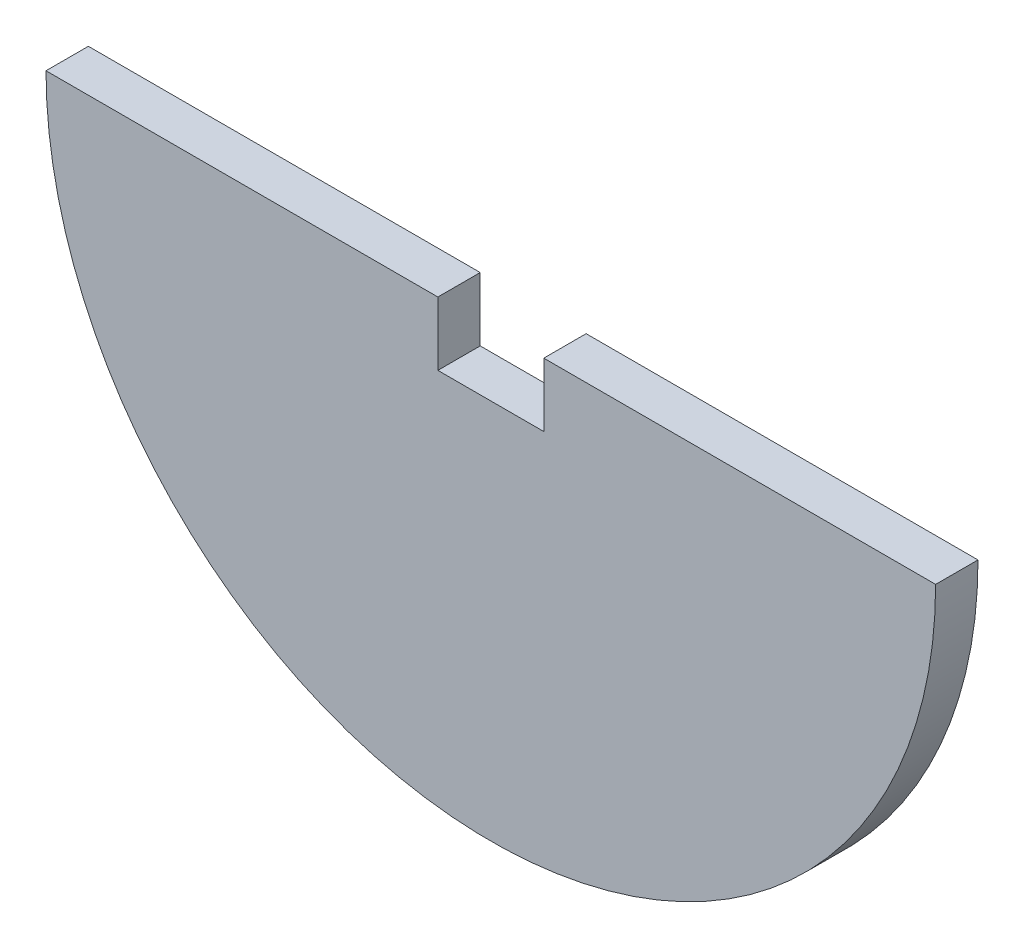
ISO-10303-21;
HEADER;
FILE_DESCRIPTION(('STEP AP214'),'2;1');
FILE_NAME('part.step','',(''),(''),'','','');
FILE_SCHEMA(('AUTOMOTIVE_DESIGN { 1 0 10303 214 1 1 1 1 }'));
ENDSEC;
DATA;
#1=APPLICATION_CONTEXT('core data for automotive mechanical design processes');
#2=APPLICATION_PROTOCOL_DEFINITION('international standard','automotive_design',2000,#1);
#3=PRODUCT_CONTEXT('',#1,'mechanical');
#4=PRODUCT('Part','Part','',(#3));
#5=PRODUCT_RELATED_PRODUCT_CATEGORY('part','',(#4));
#6=PRODUCT_DEFINITION_FORMATION('','',#4);
#7=PRODUCT_DEFINITION_CONTEXT('part definition',#1,'design');
#8=PRODUCT_DEFINITION('design','',#6,#7);
#9=PRODUCT_DEFINITION_SHAPE('','',#8);
#10=(LENGTH_UNIT() NAMED_UNIT(*) SI_UNIT(.MILLI.,.METRE.));
#11=(NAMED_UNIT(*) PLANE_ANGLE_UNIT() SI_UNIT($,.RADIAN.));
#12=(NAMED_UNIT(*) SI_UNIT($,.STERADIAN.) SOLID_ANGLE_UNIT());
#13=UNCERTAINTY_MEASURE_WITH_UNIT(LENGTH_MEASURE(1.E-05),#10,'distance_accuracy_value','');
#14=(GEOMETRIC_REPRESENTATION_CONTEXT(3) GLOBAL_UNCERTAINTY_ASSIGNED_CONTEXT((#13)) GLOBAL_UNIT_ASSIGNED_CONTEXT((#10,
#11,#12)) REPRESENTATION_CONTEXT('',''));
#15=CARTESIAN_POINT('',(0.,0.,0.));
#16=DIRECTION('',(0.,0.,1.));
#17=DIRECTION('',(1.,0.,0.));
#18=AXIS2_PLACEMENT_3D('',#15,#16,#17);
#19=CARTESIAN_POINT('',(0.,-45.3837077877816,15.));
#20=DIRECTION('',(0.,-1.,0.));
#21=DIRECTION('',(0.,0.,-1.));
#22=AXIS2_PLACEMENT_3D('',#19,#20,#21);
#23=PLANE('',#22);
#24=DIRECTION('',(-1.,0.,0.));
#25=VECTOR('',#24,1.);
#26=CARTESIAN_POINT('',(0.,-45.3837077877816,5.));
#27=LINE('',#26,#25);
#28=CARTESIAN_POINT('',(-12.5,-45.3837077877816,5.));
#29=VERTEX_POINT('',#28);
#30=CARTESIAN_POINT('',(-105.,-45.3837077877816,5.));
#31=VERTEX_POINT('',#30);
#32=EDGE_CURVE('E122',#29,#31,#27,.T.);
#33=ORIENTED_EDGE('',*,*,#32,.T.);
#34=DIRECTION('',(0.,0.,-1.));
#35=VECTOR('',#34,1.);
#36=CARTESIAN_POINT('',(-105.,-45.3837077877816,15.));
#37=LINE('',#36,#35);
#38=CARTESIAN_POINT('',(-105.,-45.3837077877816,15.));
#39=VERTEX_POINT('',#38);
#40=EDGE_CURVE('E11',#39,#31,#37,.T.);
#41=ORIENTED_EDGE('',*,*,#40,.F.);
#42=DIRECTION('',(-1.,0.,0.));
#43=VECTOR('',#42,1.);
#44=CARTESIAN_POINT('',(0.,-45.3837077877816,15.));
#45=LINE('',#44,#43);
#46=CARTESIAN_POINT('',(-12.5,-45.3837077877816,15.));
#47=VERTEX_POINT('',#46);
#48=EDGE_CURVE('E136',#47,#39,#45,.T.);
#49=ORIENTED_EDGE('',*,*,#48,.F.);
#50=DIRECTION('',(0.,0.,-1.));
#51=VECTOR('',#50,1.);
#52=CARTESIAN_POINT('',(-12.5,-45.3837077877816,15.));
#53=LINE('',#52,#51);
#54=EDGE_CURVE('E54',#47,#29,#53,.T.);
#55=ORIENTED_EDGE('',*,*,#54,.T.);
#56=EDGE_LOOP('',(#33,#41,#49,#55));
#57=FACE_BOUND('',#56,.T.);
#58=ADVANCED_FACE('F38',(#57),#23,.F.);
#59=CARTESIAN_POINT('',(0.,-45.3837077877816,15.));
#60=DIRECTION('',(0.,0.,-1.));
#61=DIRECTION('',(-1.,0.,0.));
#62=AXIS2_PLACEMENT_3D('',#59,#60,#61);
#63=CYLINDRICAL_SURFACE('',#62,105.);
#64=CARTESIAN_POINT('',(0.,-45.3837077877816,5.));
#65=DIRECTION('',(0.,0.,1.));
#66=DIRECTION('',(1.,0.,0.));
#67=AXIS2_PLACEMENT_3D('',#64,#65,#66);
#68=CIRCLE('',#67,105.);
#69=CARTESIAN_POINT('',(105.,-45.3837077877816,5.));
#70=VERTEX_POINT('',#69);
#71=EDGE_CURVE('E124',#31,#70,#68,.T.);
#72=ORIENTED_EDGE('',*,*,#71,.T.);
#73=DIRECTION('',(0.,0.,-1.));
#74=VECTOR('',#73,1.);
#75=CARTESIAN_POINT('',(105.,-45.3837077877816,15.));
#76=LINE('',#75,#74);
#77=CARTESIAN_POINT('',(105.,-45.3837077877816,15.));
#78=VERTEX_POINT('',#77);
#79=EDGE_CURVE('E46',#78,#70,#76,.T.);
#80=ORIENTED_EDGE('',*,*,#79,.F.);
#81=CARTESIAN_POINT('',(0.,-45.3837077877816,15.));
#82=DIRECTION('',(0.,0.,1.));
#83=DIRECTION('',(1.,0.,0.));
#84=AXIS2_PLACEMENT_3D('',#81,#82,#83);
#85=CIRCLE('',#84,105.);
#86=EDGE_CURVE('E86',#39,#78,#85,.T.);
#87=ORIENTED_EDGE('',*,*,#86,.F.);
#88=ORIENTED_EDGE('',*,*,#40,.T.);
#89=EDGE_LOOP('',(#72,#80,#87,#88));
#90=FACE_BOUND('',#89,.T.);
#91=ADVANCED_FACE('F142',(#90),#63,.T.);
#92=CARTESIAN_POINT('',(0.,-45.3837077877816,15.));
#93=DIRECTION('',(0.,1.,0.));
#94=DIRECTION('',(0.,0.,1.));
#95=AXIS2_PLACEMENT_3D('',#92,#93,#94);
#96=PLANE('',#95);
#97=DIRECTION('',(1.,0.,0.));
#98=VECTOR('',#97,1.);
#99=CARTESIAN_POINT('',(0.,-45.3837077877816,5.));
#100=LINE('',#99,#98);
#101=CARTESIAN_POINT('',(12.5,-45.3837077877816,5.));
#102=VERTEX_POINT('',#101);
#103=EDGE_CURVE('E127',#102,#70,#100,.T.);
#104=ORIENTED_EDGE('',*,*,#103,.F.);
#105=DIRECTION('',(0.,0.,-1.));
#106=VECTOR('',#105,1.);
#107=CARTESIAN_POINT('',(12.5,-45.3837077877816,15.));
#108=LINE('',#107,#106);
#109=CARTESIAN_POINT('',(12.5,-45.3837077877816,15.));
#110=VERTEX_POINT('',#109);
#111=EDGE_CURVE('E114',#110,#102,#108,.T.);
#112=ORIENTED_EDGE('',*,*,#111,.F.);
#113=DIRECTION('',(1.,0.,0.));
#114=VECTOR('',#113,1.);
#115=CARTESIAN_POINT('',(0.,-45.3837077877816,15.));
#116=LINE('',#115,#114);
#117=EDGE_CURVE('E104',#110,#78,#116,.T.);
#118=ORIENTED_EDGE('',*,*,#117,.T.);
#119=ORIENTED_EDGE('',*,*,#79,.T.);
#120=EDGE_LOOP('',(#104,#112,#118,#119));
#121=FACE_BOUND('',#120,.T.);
#122=ADVANCED_FACE('F141',(#121),#96,.T.);
#123=CARTESIAN_POINT('',(12.5,-45.3837077877816,15.));
#124=DIRECTION('',(1.,0.,0.));
#125=DIRECTION('',(0.,1.,0.));
#126=AXIS2_PLACEMENT_3D('',#123,#124,#125);
#127=PLANE('',#126);
#128=DIRECTION('',(0.,-1.,0.));
#129=VECTOR('',#128,1.);
#130=CARTESIAN_POINT('',(12.5,-45.3837077877816,5.));
#131=LINE('',#130,#129);
#132=CARTESIAN_POINT('',(12.5,-60.3837077877816,5.));
#133=VERTEX_POINT('',#132);
#134=EDGE_CURVE('E111',#102,#133,#131,.T.);
#135=ORIENTED_EDGE('',*,*,#134,.T.);
#136=DIRECTION('',(0.,0.,-1.));
#137=VECTOR('',#136,1.);
#138=CARTESIAN_POINT('',(12.5,-60.3837077877816,15.));
#139=LINE('',#138,#137);
#140=CARTESIAN_POINT('',(12.5,-60.3837077877816,15.));
#141=VERTEX_POINT('',#140);
#142=EDGE_CURVE('E108',#141,#133,#139,.T.);
#143=ORIENTED_EDGE('',*,*,#142,.F.);
#144=DIRECTION('',(0.,-1.,0.));
#145=VECTOR('',#144,1.);
#146=CARTESIAN_POINT('',(12.5,-45.3837077877816,15.));
#147=LINE('',#146,#145);
#148=EDGE_CURVE('E97',#110,#141,#147,.T.);
#149=ORIENTED_EDGE('',*,*,#148,.F.);
#150=ORIENTED_EDGE('',*,*,#111,.T.);
#151=EDGE_LOOP('',(#135,#143,#149,#150));
#152=FACE_BOUND('',#151,.T.);
#153=ADVANCED_FACE('F109',(#152),#127,.F.);
#154=CARTESIAN_POINT('',(0.,-60.3837077877816,15.));
#155=DIRECTION('',(0.,1.,0.));
#156=DIRECTION('',(0.,0.,1.));
#157=AXIS2_PLACEMENT_3D('',#154,#155,#156);
#158=PLANE('',#157);
#159=DIRECTION('',(1.,0.,0.));
#160=VECTOR('',#159,1.);
#161=CARTESIAN_POINT('',(0.,-60.3837077877816,5.));
#162=LINE('',#161,#160);
#163=CARTESIAN_POINT('',(-12.5,-60.3837077877816,5.));
#164=VERTEX_POINT('',#163);
#165=EDGE_CURVE('E131',#164,#133,#162,.T.);
#166=ORIENTED_EDGE('',*,*,#165,.F.);
#167=DIRECTION('',(0.,0.,-1.));
#168=VECTOR('',#167,1.);
#169=CARTESIAN_POINT('',(-12.5,-60.3837077877816,15.));
#170=LINE('',#169,#168);
#171=CARTESIAN_POINT('',(-12.5,-60.3837077877816,15.));
#172=VERTEX_POINT('',#171);
#173=EDGE_CURVE('E74',#172,#164,#170,.T.);
#174=ORIENTED_EDGE('',*,*,#173,.F.);
#175=DIRECTION('',(1.,0.,0.));
#176=VECTOR('',#175,1.);
#177=CARTESIAN_POINT('',(0.,-60.3837077877816,15.));
#178=LINE('',#177,#176);
#179=EDGE_CURVE('E102',#172,#141,#178,.T.);
#180=ORIENTED_EDGE('',*,*,#179,.T.);
#181=ORIENTED_EDGE('',*,*,#142,.T.);
#182=EDGE_LOOP('',(#166,#174,#180,#181));
#183=FACE_BOUND('',#182,.T.);
#184=ADVANCED_FACE('F116',(#183),#158,.T.);
#185=CARTESIAN_POINT('',(-12.5,-45.3837077877816,15.));
#186=DIRECTION('',(1.,0.,0.));
#187=DIRECTION('',(0.,0.,-1.));
#188=AXIS2_PLACEMENT_3D('',#185,#186,#187);
#189=PLANE('',#188);
#190=DIRECTION('',(0.,-1.,0.));
#191=VECTOR('',#190,1.);
#192=CARTESIAN_POINT('',(-12.5,-45.3837077877816,5.));
#193=LINE('',#192,#191);
#194=EDGE_CURVE('E133',#29,#164,#193,.T.);
#195=ORIENTED_EDGE('',*,*,#194,.F.);
#196=ORIENTED_EDGE('',*,*,#54,.F.);
#197=DIRECTION('',(0.,-1.,0.));
#198=VECTOR('',#197,1.);
#199=CARTESIAN_POINT('',(-12.5,-45.3837077877816,15.));
#200=LINE('',#199,#198);
#201=EDGE_CURVE('E117',#47,#172,#200,.T.);
#202=ORIENTED_EDGE('',*,*,#201,.T.);
#203=ORIENTED_EDGE('',*,*,#173,.T.);
#204=EDGE_LOOP('',(#195,#196,#202,#203));
#205=FACE_BOUND('',#204,.T.);
#206=ADVANCED_FACE('F146',(#205),#189,.T.);
#207=CARTESIAN_POINT('',(0.,-45.3837077877816,15.));
#208=DIRECTION('',(0.,0.,1.));
#209=DIRECTION('',(1.,0.,0.));
#210=AXIS2_PLACEMENT_3D('',#207,#208,#209);
#211=PLANE('',#210);
#212=ORIENTED_EDGE('',*,*,#48,.T.);
#213=ORIENTED_EDGE('',*,*,#86,.T.);
#214=ORIENTED_EDGE('',*,*,#117,.F.);
#215=ORIENTED_EDGE('',*,*,#148,.T.);
#216=ORIENTED_EDGE('',*,*,#179,.F.);
#217=ORIENTED_EDGE('',*,*,#201,.F.);
#218=EDGE_LOOP('',(#212,#213,#214,#215,#216,#217));
#219=FACE_BOUND('',#218,.T.);
#220=ADVANCED_FACE('F99',(#219),#211,.T.);
#221=CARTESIAN_POINT('',(0.,-45.3837077877816,5.));
#222=DIRECTION('',(0.,0.,1.));
#223=DIRECTION('',(1.,0.,0.));
#224=AXIS2_PLACEMENT_3D('',#221,#222,#223);
#225=PLANE('',#224);
#226=ORIENTED_EDGE('',*,*,#32,.F.);
#227=ORIENTED_EDGE('',*,*,#194,.T.);
#228=ORIENTED_EDGE('',*,*,#165,.T.);
#229=ORIENTED_EDGE('',*,*,#134,.F.);
#230=ORIENTED_EDGE('',*,*,#103,.T.);
#231=ORIENTED_EDGE('',*,*,#71,.F.);
#232=EDGE_LOOP('',(#226,#227,#228,#229,#230,#231));
#233=FACE_BOUND('',#232,.T.);
#234=ADVANCED_FACE('F145',(#233),#225,.F.);
#235=CLOSED_SHELL('',(#58,#91,#122,#153,#184,#206,#220,#234));
#236=MANIFOLD_SOLID_BREP('B2',#235);
#237=ADVANCED_BREP_SHAPE_REPRESENTATION('',(#18,#236),#14);
#238=SHAPE_DEFINITION_REPRESENTATION(#9,#237);
ENDSEC;
END-ISO-10303-21;
